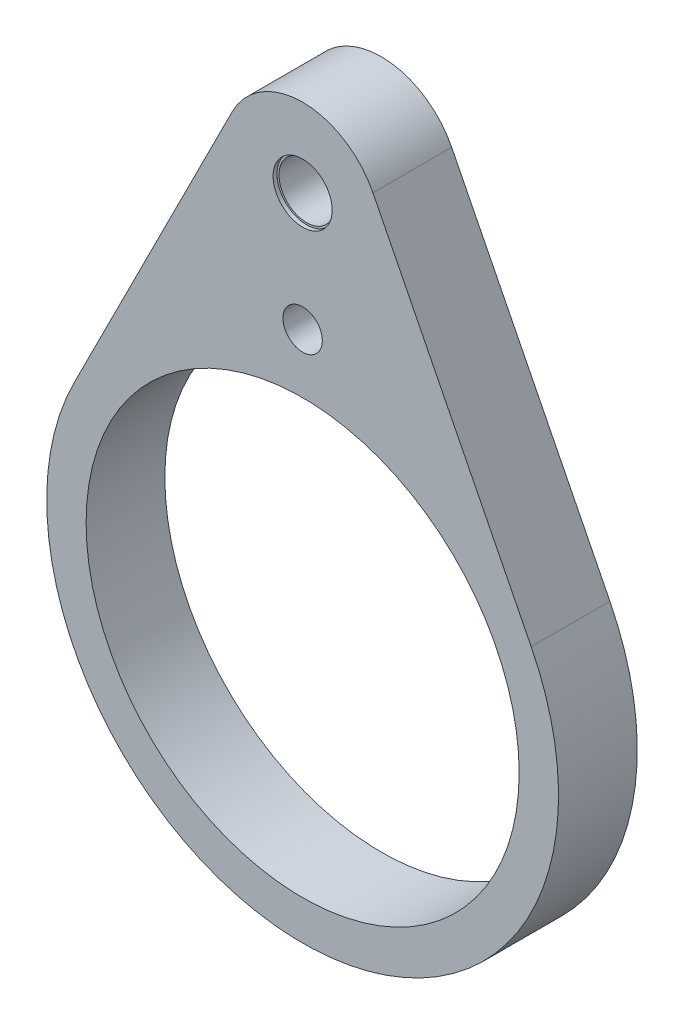
ISO-10303-21;
HEADER;
FILE_DESCRIPTION(('STEP AP214'),'2;1');
FILE_NAME('part.step','',(''),(''),'','','');
FILE_SCHEMA(('AUTOMOTIVE_DESIGN { 1 0 10303 214 1 1 1 1 }'));
ENDSEC;
DATA;
#1=APPLICATION_CONTEXT('core data for automotive mechanical design processes');
#2=APPLICATION_PROTOCOL_DEFINITION('international standard','automotive_design',2000,#1);
#3=PRODUCT_CONTEXT('',#1,'mechanical');
#4=PRODUCT('Part','Part','',(#3));
#5=PRODUCT_RELATED_PRODUCT_CATEGORY('part','',(#4));
#6=PRODUCT_DEFINITION_FORMATION('','',#4);
#7=PRODUCT_DEFINITION_CONTEXT('part definition',#1,'design');
#8=PRODUCT_DEFINITION('design','',#6,#7);
#9=PRODUCT_DEFINITION_SHAPE('','',#8);
#10=(LENGTH_UNIT() NAMED_UNIT(*) SI_UNIT(.MILLI.,.METRE.));
#11=(NAMED_UNIT(*) PLANE_ANGLE_UNIT() SI_UNIT($,.RADIAN.));
#12=(NAMED_UNIT(*) SI_UNIT($,.STERADIAN.) SOLID_ANGLE_UNIT());
#13=UNCERTAINTY_MEASURE_WITH_UNIT(LENGTH_MEASURE(1.E-05),#10,'distance_accuracy_value','');
#14=(GEOMETRIC_REPRESENTATION_CONTEXT(3) GLOBAL_UNCERTAINTY_ASSIGNED_CONTEXT((#13)) GLOBAL_UNIT_ASSIGNED_CONTEXT((#10,
#11,#12)) REPRESENTATION_CONTEXT('',''));
#15=CARTESIAN_POINT('',(0.,0.,0.));
#16=DIRECTION('',(0.,0.,1.));
#17=DIRECTION('',(1.,0.,0.));
#18=AXIS2_PLACEMENT_3D('',#15,#16,#17);
#19=CARTESIAN_POINT('',(0.,100.,-61.1543772678641));
#20=DIRECTION('',(0.,0.,1.));
#21=DIRECTION('',(1.,0.,0.));
#22=AXIS2_PLACEMENT_3D('',#19,#20,#21);
#23=CYLINDRICAL_SURFACE('',#22,7.);
#24=CARTESIAN_POINT('',(0.,100.,105.2));
#25=DIRECTION('',(0.,0.,1.));
#26=DIRECTION('',(1.,0.,0.));
#27=AXIS2_PLACEMENT_3D('',#24,#25,#26);
#28=CIRCLE('',#27,7.);
#29=CARTESIAN_POINT('',(7.,100.,105.2));
#30=VERTEX_POINT('',#29);
#31=EDGE_CURVE('E107',#30,#30,#28,.F.);
#32=ORIENTED_EDGE('',*,*,#31,.F.);
#33=EDGE_LOOP('',(#32));
#34=FACE_BOUND('',#33,.T.);
#35=CARTESIAN_POINT('',(0.,100.,87.2));
#36=DIRECTION('',(0.,0.,-1.));
#37=DIRECTION('',(-1.,0.,0.));
#38=AXIS2_PLACEMENT_3D('',#35,#36,#37);
#39=CIRCLE('',#38,7.);
#40=CARTESIAN_POINT('',(-7.,100.,87.2));
#41=VERTEX_POINT('',#40);
#42=EDGE_CURVE('E50',#41,#41,#39,.F.);
#43=ORIENTED_EDGE('',*,*,#42,.F.);
#44=EDGE_LOOP('',(#43));
#45=FACE_BOUND('',#44,.T.);
#46=ADVANCED_FACE('F43',(#34,#45),#23,.F.);
#47=CARTESIAN_POINT('',(0.,0.,-97.6477631085024));
#48=DIRECTION('',(0.,0.,1.));
#49=DIRECTION('',(1.,0.,0.));
#50=AXIS2_PLACEMENT_3D('',#47,#48,#49);
#51=CYLINDRICAL_SURFACE('',#50,65.);
#52=CARTESIAN_POINT('',(0.,0.,106.2));
#53=DIRECTION('',(0.,0.,1.));
#54=DIRECTION('',(1.,0.,0.));
#55=AXIS2_PLACEMENT_3D('',#52,#53,#54);
#56=CIRCLE('',#55,65.);
#57=CARTESIAN_POINT('',(-58.0468560733482,29.25,106.2));
#58=VERTEX_POINT('',#57);
#59=CARTESIAN_POINT('',(58.0468560733482,29.25,106.2));
#60=VERTEX_POINT('',#59);
#61=EDGE_CURVE('E135',#58,#60,#56,.T.);
#62=ORIENTED_EDGE('',*,*,#61,.F.);
#63=DIRECTION('',(0.,0.,1.));
#64=VECTOR('',#63,1.);
#65=CARTESIAN_POINT('',(-58.0468560733482,29.25,-61.1543772678641));
#66=LINE('',#65,#64);
#67=CARTESIAN_POINT('',(-58.0468560733482,29.25,86.2));
#68=VERTEX_POINT('',#67);
#69=EDGE_CURVE('E98',#68,#58,#66,.T.);
#70=ORIENTED_EDGE('',*,*,#69,.F.);
#71=CARTESIAN_POINT('',(0.,0.,86.2));
#72=DIRECTION('',(0.,0.,1.));
#73=DIRECTION('',(1.,0.,0.));
#74=AXIS2_PLACEMENT_3D('',#71,#72,#73);
#75=CIRCLE('',#74,65.);
#76=CARTESIAN_POINT('',(58.0468560733482,29.25,86.2));
#77=VERTEX_POINT('',#76);
#78=EDGE_CURVE('E55',#77,#68,#75,.F.);
#79=ORIENTED_EDGE('',*,*,#78,.F.);
#80=DIRECTION('',(0.,0.,1.));
#81=VECTOR('',#80,1.);
#82=CARTESIAN_POINT('',(58.0468560733482,29.25,-61.1543772678641));
#83=LINE('',#82,#81);
#84=EDGE_CURVE('E58',#77,#60,#83,.T.);
#85=ORIENTED_EDGE('',*,*,#84,.T.);
#86=EDGE_LOOP('',(#62,#70,#79,#85));
#87=FACE_BOUND('',#86,.T.);
#88=ADVANCED_FACE('F136',(#87),#51,.T.);
#89=CARTESIAN_POINT('',(0.,70.,10.));
#90=DIRECTION('',(0.,0.,-1.));
#91=DIRECTION('',(-1.,0.,0.));
#92=AXIS2_PLACEMENT_3D('',#89,#90,#91);
#93=CYLINDRICAL_SURFACE('',#92,5.);
#94=CARTESIAN_POINT('',(0.,70.,106.2));
#95=DIRECTION('',(0.,0.,1.));
#96=DIRECTION('',(1.,0.,0.));
#97=AXIS2_PLACEMENT_3D('',#94,#95,#96);
#98=CIRCLE('',#97,5.);
#99=CARTESIAN_POINT('',(5.,70.,106.2));
#100=VERTEX_POINT('',#99);
#101=EDGE_CURVE('E11',#100,#100,#98,.T.);
#102=ORIENTED_EDGE('',*,*,#101,.T.);
#103=EDGE_LOOP('',(#102));
#104=FACE_BOUND('',#103,.T.);
#105=CARTESIAN_POINT('',(0.,70.,86.2));
#106=DIRECTION('',(0.,0.,-1.));
#107=DIRECTION('',(-1.,0.,0.));
#108=AXIS2_PLACEMENT_3D('',#105,#106,#107);
#109=CIRCLE('',#108,5.);
#110=CARTESIAN_POINT('',(-5.,70.,86.2));
#111=VERTEX_POINT('',#110);
#112=EDGE_CURVE('E124',#111,#111,#109,.T.);
#113=ORIENTED_EDGE('',*,*,#112,.T.);
#114=EDGE_LOOP('',(#113));
#115=FACE_BOUND('',#114,.T.);
#116=ADVANCED_FACE('F44',(#104,#115),#93,.F.);
#117=CARTESIAN_POINT('',(0.,70.,86.2));
#118=DIRECTION('',(0.,0.,1.));
#119=DIRECTION('',(1.,0.,0.));
#120=AXIS2_PLACEMENT_3D('',#117,#118,#119);
#121=PLANE('',#120);
#122=CARTESIAN_POINT('',(0.,100.,86.2));
#123=DIRECTION('',(0.,0.,-1.));
#124=DIRECTION('',(-1.,0.,0.));
#125=AXIS2_PLACEMENT_3D('',#122,#123,#124);
#126=CIRCLE('',#125,7.5);
#127=CARTESIAN_POINT('',(-7.5,100.,86.2));
#128=VERTEX_POINT('',#127);
#129=EDGE_CURVE('E162',#128,#128,#126,.T.);
#130=ORIENTED_EDGE('',*,*,#129,.F.);
#131=EDGE_LOOP('',(#130));
#132=FACE_BOUND('',#131,.T.);
#133=CARTESIAN_POINT('',(0.,0.,86.2));
#134=DIRECTION('',(0.,0.,1.));
#135=DIRECTION('',(1.,0.,0.));
#136=AXIS2_PLACEMENT_3D('',#133,#134,#135);
#137=CIRCLE('',#136,55.);
#138=CARTESIAN_POINT('',(55.,0.,86.2));
#139=VERTEX_POINT('',#138);
#140=EDGE_CURVE('E126',#139,#139,#137,.F.);
#141=ORIENTED_EDGE('',*,*,#140,.F.);
#142=EDGE_LOOP('',(#141));
#143=FACE_BOUND('',#142,.T.);
#144=ORIENTED_EDGE('',*,*,#78,.T.);
#145=DIRECTION('',(-0.45,-0.893028554974588,0.));
#146=VECTOR('',#145,1.);
#147=CARTESIAN_POINT('',(-58.0468560733482,29.25,86.2));
#148=LINE('',#147,#146);
#149=CARTESIAN_POINT('',(-17.8605710994918,109.,86.2));
#150=VERTEX_POINT('',#149);
#151=EDGE_CURVE('E67',#150,#68,#148,.T.);
#152=ORIENTED_EDGE('',*,*,#151,.F.);
#153=CARTESIAN_POINT('',(0.,100.,86.2));
#154=DIRECTION('',(0.,0.,1.));
#155=DIRECTION('',(1.,0.,0.));
#156=AXIS2_PLACEMENT_3D('',#153,#154,#155);
#157=CIRCLE('',#156,20.);
#158=CARTESIAN_POINT('',(17.8605710994918,109.,86.2));
#159=VERTEX_POINT('',#158);
#160=EDGE_CURVE('E92',#159,#150,#157,.T.);
#161=ORIENTED_EDGE('',*,*,#160,.F.);
#162=DIRECTION('',(0.45,-0.893028554974588,0.));
#163=VECTOR('',#162,1.);
#164=CARTESIAN_POINT('',(58.0468560733482,29.25,86.2));
#165=LINE('',#164,#163);
#166=EDGE_CURVE('E125',#159,#77,#165,.T.);
#167=ORIENTED_EDGE('',*,*,#166,.T.);
#168=EDGE_LOOP('',(#144,#152,#161,#167));
#169=FACE_BOUND('',#168,.T.);
#170=ORIENTED_EDGE('',*,*,#112,.F.);
#171=EDGE_LOOP('',(#170));
#172=FACE_BOUND('',#171,.T.);
#173=ADVANCED_FACE('F134',(#132,#143,#169,#172),#121,.F.);
#174=CARTESIAN_POINT('',(0.,70.,106.2));
#175=DIRECTION('',(0.,0.,1.));
#176=DIRECTION('',(1.,0.,0.));
#177=AXIS2_PLACEMENT_3D('',#174,#175,#176);
#178=PLANE('',#177);
#179=CARTESIAN_POINT('',(0.,100.,106.2));
#180=DIRECTION('',(0.,0.,1.));
#181=DIRECTION('',(1.,0.,0.));
#182=AXIS2_PLACEMENT_3D('',#179,#180,#181);
#183=CIRCLE('',#182,7.5);
#184=CARTESIAN_POINT('',(7.5,100.,106.2));
#185=VERTEX_POINT('',#184);
#186=EDGE_CURVE('E215',#185,#185,#183,.T.);
#187=ORIENTED_EDGE('',*,*,#186,.F.);
#188=EDGE_LOOP('',(#187));
#189=FACE_BOUND('',#188,.T.);
#190=DIRECTION('',(0.45,0.893028554974588,0.));
#191=VECTOR('',#190,1.);
#192=CARTESIAN_POINT('',(-58.0468560733482,29.25,106.2));
#193=LINE('',#192,#191);
#194=CARTESIAN_POINT('',(-17.8605710994918,109.,106.2));
#195=VERTEX_POINT('',#194);
#196=EDGE_CURVE('E99',#58,#195,#193,.T.);
#197=ORIENTED_EDGE('',*,*,#196,.F.);
#198=ORIENTED_EDGE('',*,*,#61,.T.);
#199=DIRECTION('',(-0.45,0.893028554974588,0.));
#200=VECTOR('',#199,1.);
#201=CARTESIAN_POINT('',(58.0468560733482,29.25,106.2));
#202=LINE('',#201,#200);
#203=CARTESIAN_POINT('',(17.8605710994918,109.,106.2));
#204=VERTEX_POINT('',#203);
#205=EDGE_CURVE('E97',#60,#204,#202,.T.);
#206=ORIENTED_EDGE('',*,*,#205,.T.);
#207=CARTESIAN_POINT('',(0.,100.,106.2));
#208=DIRECTION('',(0.,0.,1.));
#209=DIRECTION('',(1.,0.,0.));
#210=AXIS2_PLACEMENT_3D('',#207,#208,#209);
#211=CIRCLE('',#210,20.);
#212=EDGE_CURVE('E95',#195,#204,#211,.F.);
#213=ORIENTED_EDGE('',*,*,#212,.F.);
#214=EDGE_LOOP('',(#197,#198,#206,#213));
#215=FACE_BOUND('',#214,.T.);
#216=CARTESIAN_POINT('',(0.,0.,106.2));
#217=DIRECTION('',(0.,0.,1.));
#218=DIRECTION('',(1.,0.,0.));
#219=AXIS2_PLACEMENT_3D('',#216,#217,#218);
#220=CIRCLE('',#219,55.);
#221=CARTESIAN_POINT('',(55.,0.,106.2));
#222=VERTEX_POINT('',#221);
#223=EDGE_CURVE('E127',#222,#222,#220,.T.);
#224=ORIENTED_EDGE('',*,*,#223,.F.);
#225=EDGE_LOOP('',(#224));
#226=FACE_BOUND('',#225,.T.);
#227=ORIENTED_EDGE('',*,*,#101,.F.);
#228=EDGE_LOOP('',(#227));
#229=FACE_BOUND('',#228,.T.);
#230=ADVANCED_FACE('F110',(#189,#215,#226,#229),#178,.T.);
#231=CARTESIAN_POINT('',(0.,0.,-69.3634918610405));
#232=DIRECTION('',(0.,0.,1.));
#233=DIRECTION('',(1.,0.,0.));
#234=AXIS2_PLACEMENT_3D('',#231,#232,#233);
#235=CYLINDRICAL_SURFACE('',#234,55.);
#236=ORIENTED_EDGE('',*,*,#140,.T.);
#237=EDGE_LOOP('',(#236));
#238=FACE_BOUND('',#237,.T.);
#239=ORIENTED_EDGE('',*,*,#223,.T.);
#240=EDGE_LOOP('',(#239));
#241=FACE_BOUND('',#240,.T.);
#242=ADVANCED_FACE('F151',(#238,#241),#235,.F.);
#243=CARTESIAN_POINT('',(-58.0468560733482,29.25,-61.1543772678641));
#244=DIRECTION('',(0.893028554974588,-0.45,0.));
#245=DIRECTION('',(0.45,0.893028554974588,0.));
#246=AXIS2_PLACEMENT_3D('',#243,#244,#245);
#247=PLANE('',#246);
#248=DIRECTION('',(0.,0.,1.));
#249=VECTOR('',#248,1.);
#250=CARTESIAN_POINT('',(-17.8605710994918,109.,-61.1543772678641));
#251=LINE('',#250,#249);
#252=EDGE_CURVE('E90',#150,#195,#251,.T.);
#253=ORIENTED_EDGE('',*,*,#252,.F.);
#254=ORIENTED_EDGE('',*,*,#151,.T.);
#255=ORIENTED_EDGE('',*,*,#69,.T.);
#256=ORIENTED_EDGE('',*,*,#196,.T.);
#257=EDGE_LOOP('',(#253,#254,#255,#256));
#258=FACE_BOUND('',#257,.T.);
#259=ADVANCED_FACE('F103',(#258),#247,.F.);
#260=CARTESIAN_POINT('',(58.0468560733482,29.25,-61.1543772678641));
#261=DIRECTION('',(0.893028554974588,0.45,0.));
#262=DIRECTION('',(-0.45,0.893028554974588,0.));
#263=AXIS2_PLACEMENT_3D('',#260,#261,#262);
#264=PLANE('',#263);
#265=ORIENTED_EDGE('',*,*,#166,.F.);
#266=DIRECTION('',(0.,0.,1.));
#267=VECTOR('',#266,1.);
#268=CARTESIAN_POINT('',(17.8605710994918,109.,-61.1543772678641));
#269=LINE('',#268,#267);
#270=EDGE_CURVE('E120',#159,#204,#269,.T.);
#271=ORIENTED_EDGE('',*,*,#270,.T.);
#272=ORIENTED_EDGE('',*,*,#205,.F.);
#273=ORIENTED_EDGE('',*,*,#84,.F.);
#274=EDGE_LOOP('',(#265,#271,#272,#273));
#275=FACE_BOUND('',#274,.T.);
#276=ADVANCED_FACE('F172',(#275),#264,.T.);
#277=CARTESIAN_POINT('',(0.,100.,-61.1543772678641));
#278=DIRECTION('',(0.,0.,1.));
#279=DIRECTION('',(1.,0.,0.));
#280=AXIS2_PLACEMENT_3D('',#277,#278,#279);
#281=CYLINDRICAL_SURFACE('',#280,20.);
#282=ORIENTED_EDGE('',*,*,#270,.F.);
#283=ORIENTED_EDGE('',*,*,#160,.T.);
#284=ORIENTED_EDGE('',*,*,#252,.T.);
#285=ORIENTED_EDGE('',*,*,#212,.T.);
#286=EDGE_LOOP('',(#282,#283,#284,#285));
#287=FACE_BOUND('',#286,.T.);
#288=ADVANCED_FACE('F89',(#287),#281,.T.);
#289=CARTESIAN_POINT('',(0.,100.,105.2));
#290=DIRECTION('',(0.,0.,1.));
#291=DIRECTION('',(1.,0.,0.));
#292=AXIS2_PLACEMENT_3D('',#289,#290,#291);
#293=PLANE('',#292);
#294=CARTESIAN_POINT('',(0.,100.,105.2));
#295=DIRECTION('',(0.,0.,1.));
#296=DIRECTION('',(1.,0.,0.));
#297=AXIS2_PLACEMENT_3D('',#294,#295,#296);
#298=CIRCLE('',#297,7.5);
#299=CARTESIAN_POINT('',(7.5,100.,105.2));
#300=VERTEX_POINT('',#299);
#301=EDGE_CURVE('E115',#300,#300,#298,.T.);
#302=ORIENTED_EDGE('',*,*,#301,.T.);
#303=EDGE_LOOP('',(#302));
#304=FACE_BOUND('',#303,.T.);
#305=ORIENTED_EDGE('',*,*,#31,.T.);
#306=EDGE_LOOP('',(#305));
#307=FACE_BOUND('',#306,.T.);
#308=ADVANCED_FACE('F182',(#304,#307),#293,.T.);
#309=CARTESIAN_POINT('',(0.,100.,105.2));
#310=DIRECTION('',(0.,0.,1.));
#311=DIRECTION('',(1.,0.,0.));
#312=AXIS2_PLACEMENT_3D('',#309,#310,#311);
#313=CYLINDRICAL_SURFACE('',#312,7.5);
#314=ORIENTED_EDGE('',*,*,#301,.F.);
#315=EDGE_LOOP('',(#314));
#316=FACE_BOUND('',#315,.T.);
#317=ORIENTED_EDGE('',*,*,#186,.T.);
#318=EDGE_LOOP('',(#317));
#319=FACE_BOUND('',#318,.T.);
#320=ADVANCED_FACE('F190',(#316,#319),#313,.F.);
#321=CARTESIAN_POINT('',(0.,100.,87.2));
#322=DIRECTION('',(0.,0.,-1.));
#323=DIRECTION('',(-1.,0.,0.));
#324=AXIS2_PLACEMENT_3D('',#321,#322,#323);
#325=PLANE('',#324);
#326=CARTESIAN_POINT('',(0.,100.,87.2));
#327=DIRECTION('',(0.,0.,-1.));
#328=DIRECTION('',(-1.,0.,0.));
#329=AXIS2_PLACEMENT_3D('',#326,#327,#328);
#330=CIRCLE('',#329,7.5);
#331=CARTESIAN_POINT('',(-7.5,100.,87.2));
#332=VERTEX_POINT('',#331);
#333=EDGE_CURVE('E206',#332,#332,#330,.T.);
#334=ORIENTED_EDGE('',*,*,#333,.T.);
#335=EDGE_LOOP('',(#334));
#336=FACE_BOUND('',#335,.T.);
#337=ORIENTED_EDGE('',*,*,#42,.T.);
#338=EDGE_LOOP('',(#337));
#339=FACE_BOUND('',#338,.T.);
#340=ADVANCED_FACE('F194',(#336,#339),#325,.T.);
#341=CARTESIAN_POINT('',(0.,100.,87.2));
#342=DIRECTION('',(0.,0.,-1.));
#343=DIRECTION('',(-1.,0.,0.));
#344=AXIS2_PLACEMENT_3D('',#341,#342,#343);
#345=CYLINDRICAL_SURFACE('',#344,7.5);
#346=ORIENTED_EDGE('',*,*,#333,.F.);
#347=EDGE_LOOP('',(#346));
#348=FACE_BOUND('',#347,.T.);
#349=ORIENTED_EDGE('',*,*,#129,.T.);
#350=EDGE_LOOP('',(#349));
#351=FACE_BOUND('',#350,.T.);
#352=ADVANCED_FACE('F198',(#348,#351),#345,.F.);
#353=CLOSED_SHELL('',(#46,#88,#116,#173,#230,#242,#259,#276,#288,#308,#320,#340,#352));
#354=MANIFOLD_SOLID_BREP('B2',#353);
#355=ADVANCED_BREP_SHAPE_REPRESENTATION('',(#18,#354),#14);
#356=SHAPE_DEFINITION_REPRESENTATION(#9,#355);
ENDSEC;
END-ISO-10303-21;
